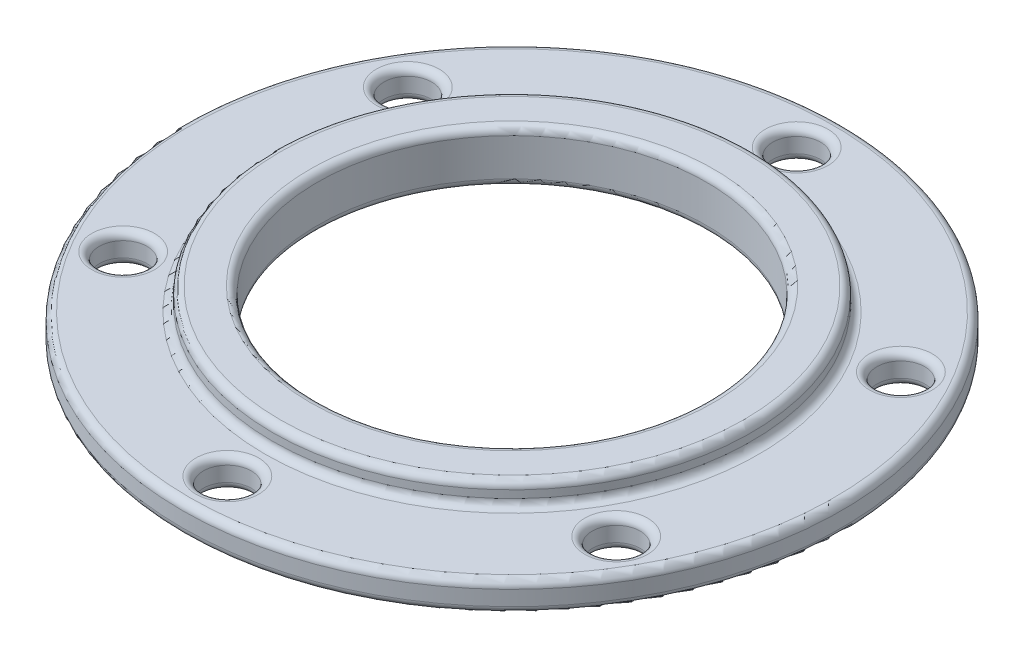
ISO-10303-21;
HEADER;
FILE_DESCRIPTION(('STEP AP214'),'2;1');
FILE_NAME('part.step','',(''),(''),'','','');
FILE_SCHEMA(('AUTOMOTIVE_DESIGN { 1 0 10303 214 1 1 1 1 }'));
ENDSEC;
DATA;
#1=APPLICATION_CONTEXT('core data for automotive mechanical design processes');
#2=APPLICATION_PROTOCOL_DEFINITION('international standard','automotive_design',2000,#1);
#3=PRODUCT_CONTEXT('',#1,'mechanical');
#4=PRODUCT('Part','Part','',(#3));
#5=PRODUCT_RELATED_PRODUCT_CATEGORY('part','',(#4));
#6=PRODUCT_DEFINITION_FORMATION('','',#4);
#7=PRODUCT_DEFINITION_CONTEXT('part definition',#1,'design');
#8=PRODUCT_DEFINITION('design','',#6,#7);
#9=PRODUCT_DEFINITION_SHAPE('','',#8);
#10=(LENGTH_UNIT() NAMED_UNIT(*) SI_UNIT(.MILLI.,.METRE.));
#11=(NAMED_UNIT(*) PLANE_ANGLE_UNIT() SI_UNIT($,.RADIAN.));
#12=(NAMED_UNIT(*) SI_UNIT($,.STERADIAN.) SOLID_ANGLE_UNIT());
#13=UNCERTAINTY_MEASURE_WITH_UNIT(LENGTH_MEASURE(1.E-05),#10,'distance_accuracy_value','');
#14=(GEOMETRIC_REPRESENTATION_CONTEXT(3) GLOBAL_UNCERTAINTY_ASSIGNED_CONTEXT((#13)) GLOBAL_UNIT_ASSIGNED_CONTEXT((#10,
#11,#12)) REPRESENTATION_CONTEXT('',''));
#15=CARTESIAN_POINT('',(0.,0.,0.));
#16=DIRECTION('',(0.,0.,1.));
#17=DIRECTION('',(1.,0.,0.));
#18=AXIS2_PLACEMENT_3D('',#15,#16,#17);
#19=CARTESIAN_POINT('',(0.,0.,0.));
#20=DIRECTION('',(0.,1.,0.));
#21=DIRECTION('',(0.,0.,1.));
#22=AXIS2_PLACEMENT_3D('',#19,#20,#21);
#23=PLANE('',#22);
#24=CARTESIAN_POINT('',(0.,0.,0.));
#25=DIRECTION('',(0.,1.,0.));
#26=DIRECTION('',(0.,0.,1.));
#27=AXIS2_PLACEMENT_3D('',#24,#25,#26);
#28=CIRCLE('',#27,16.5);
#29=CARTESIAN_POINT('',(0.,0.,16.5));
#30=VERTEX_POINT('',#29);
#31=EDGE_CURVE('E137',#30,#30,#28,.F.);
#32=ORIENTED_EDGE('',*,*,#31,.T.);
#33=EDGE_LOOP('',(#32));
#34=FACE_BOUND('',#33,.T.);
#35=CARTESIAN_POINT('',(-16.4761333069959,0.,-9.51249999999757));
#36=DIRECTION('',(0.,1.,0.));
#37=DIRECTION('',(0.,0.,1.));
#38=AXIS2_PLACEMENT_3D('',#35,#36,#37);
#39=CIRCLE('',#38,2.10000000000188);
#40=CARTESIAN_POINT('',(-16.4761333069959,0.,-7.4124999999957));
#41=VERTEX_POINT('',#40);
#42=EDGE_CURVE('E141',#41,#41,#39,.F.);
#43=ORIENTED_EDGE('',*,*,#42,.T.);
#44=EDGE_LOOP('',(#43));
#45=FACE_BOUND('',#44,.T.);
#46=CARTESIAN_POINT('',(-16.4761333069948,0.,9.51249999999948));
#47=DIRECTION('',(0.,1.,0.));
#48=DIRECTION('',(0.,0.,1.));
#49=AXIS2_PLACEMENT_3D('',#46,#47,#48);
#50=CIRCLE('',#49,2.10000000000286);
#51=CARTESIAN_POINT('',(-16.4761333069948,0.,11.6125000000023));
#52=VERTEX_POINT('',#51);
#53=EDGE_CURVE('E145',#52,#52,#50,.F.);
#54=ORIENTED_EDGE('',*,*,#53,.T.);
#55=EDGE_LOOP('',(#54));
#56=FACE_BOUND('',#55,.T.);
#57=CARTESIAN_POINT('',(2.16978020385542E-12,0.,19.0249999999971));
#58=DIRECTION('',(0.,1.,0.));
#59=DIRECTION('',(0.,0.,1.));
#60=AXIS2_PLACEMENT_3D('',#57,#58,#59);
#61=CIRCLE('',#60,2.10000000000306);
#62=CARTESIAN_POINT('',(2.16978020385542E-12,0.,21.1250000000001));
#63=VERTEX_POINT('',#62);
#64=EDGE_CURVE('E149',#63,#63,#61,.F.);
#65=ORIENTED_EDGE('',*,*,#64,.T.);
#66=EDGE_LOOP('',(#65));
#67=FACE_BOUND('',#66,.T.);
#68=CARTESIAN_POINT('',(16.476133306998,0.,9.51249999999758));
#69=DIRECTION('',(0.,1.,0.));
#70=DIRECTION('',(0.,0.,1.));
#71=AXIS2_PLACEMENT_3D('',#68,#69,#70);
#72=CIRCLE('',#71,2.10000000000223);
#73=CARTESIAN_POINT('',(16.476133306998,0.,11.6124999999998));
#74=VERTEX_POINT('',#73);
#75=EDGE_CURVE('E153',#74,#74,#72,.F.);
#76=ORIENTED_EDGE('',*,*,#75,.T.);
#77=EDGE_LOOP('',(#76));
#78=FACE_BOUND('',#77,.T.);
#79=CARTESIAN_POINT('',(16.4761333069969,0.,-9.51249999999948));
#80=DIRECTION('',(0.,1.,0.));
#81=DIRECTION('',(0.,0.,1.));
#82=AXIS2_PLACEMENT_3D('',#79,#80,#81);
#83=CIRCLE('',#82,2.10000000000115);
#84=CARTESIAN_POINT('',(16.4761333069969,0.,-7.41249999999832));
#85=VERTEX_POINT('',#84);
#86=EDGE_CURVE('E157',#85,#85,#83,.F.);
#87=ORIENTED_EDGE('',*,*,#86,.T.);
#88=EDGE_LOOP('',(#87));
#89=FACE_BOUND('',#88,.T.);
#90=CARTESIAN_POINT('',(0.,0.,-19.0249999999971));
#91=DIRECTION('',(0.,1.,0.));
#92=DIRECTION('',(0.,0.,1.));
#93=AXIS2_PLACEMENT_3D('',#90,#91,#92);
#94=CIRCLE('',#93,2.10000000000087);
#95=CARTESIAN_POINT('',(0.,0.,-16.9249999999962));
#96=VERTEX_POINT('',#95);
#97=EDGE_CURVE('E160',#96,#96,#94,.F.);
#98=ORIENTED_EDGE('',*,*,#97,.T.);
#99=EDGE_LOOP('',(#98));
#100=FACE_BOUND('',#99,.T.);
#101=CARTESIAN_POINT('',(0.,0.,0.));
#102=DIRECTION('',(0.,1.,0.));
#103=DIRECTION('',(0.,0.,1.));
#104=AXIS2_PLACEMENT_3D('',#101,#102,#103);
#105=CIRCLE('',#104,21.525);
#106=CARTESIAN_POINT('',(0.,0.,21.525));
#107=VERTEX_POINT('',#106);
#108=EDGE_CURVE('E164',#107,#107,#105,.T.);
#109=ORIENTED_EDGE('',*,*,#108,.T.);
#110=EDGE_LOOP('',(#109));
#111=FACE_BOUND('',#110,.T.);
#112=ADVANCED_FACE('F39',(#34,#45,#56,#67,#78,#89,#100,#111),#23,.T.);
#113=CARTESIAN_POINT('',(0.,-2.,0.));
#114=DIRECTION('',(0.,1.,0.));
#115=DIRECTION('',(0.,0.,1.));
#116=AXIS2_PLACEMENT_3D('',#113,#114,#115);
#117=CYLINDRICAL_SURFACE('',#116,22.025);
#118=CARTESIAN_POINT('',(0.,-0.5,0.));
#119=DIRECTION('',(0.,1.,0.));
#120=DIRECTION('',(0.,0.,1.));
#121=AXIS2_PLACEMENT_3D('',#118,#119,#120);
#122=CIRCLE('',#121,22.025);
#123=CARTESIAN_POINT('',(0.,-0.5,22.025));
#124=VERTEX_POINT('',#123);
#125=EDGE_CURVE('E82',#124,#124,#122,.F.);
#126=ORIENTED_EDGE('',*,*,#125,.T.);
#127=EDGE_LOOP('',(#126));
#128=FACE_BOUND('',#127,.T.);
#129=CARTESIAN_POINT('',(0.,-1.5,0.));
#130=DIRECTION('',(0.,1.,0.));
#131=DIRECTION('',(0.,0.,1.));
#132=AXIS2_PLACEMENT_3D('',#129,#130,#131);
#133=CIRCLE('',#132,22.025);
#134=CARTESIAN_POINT('',(0.,-1.5,22.025));
#135=VERTEX_POINT('',#134);
#136=EDGE_CURVE('E86',#135,#135,#133,.T.);
#137=ORIENTED_EDGE('',*,*,#136,.T.);
#138=EDGE_LOOP('',(#137));
#139=FACE_BOUND('',#138,.T.);
#140=ADVANCED_FACE('F206',(#128,#139),#117,.T.);
#141=CARTESIAN_POINT('',(0.,-2.,0.));
#142=DIRECTION('',(0.,1.,0.));
#143=DIRECTION('',(0.,0.,1.));
#144=AXIS2_PLACEMENT_3D('',#141,#142,#143);
#145=PLANE('',#144);
#146=CARTESIAN_POINT('',(0.,-2.,0.));
#147=DIRECTION('',(0.,1.,0.));
#148=DIRECTION('',(0.,0.,1.));
#149=AXIS2_PLACEMENT_3D('',#146,#147,#148);
#150=CIRCLE('',#149,21.525);
#151=CARTESIAN_POINT('',(0.,-2.,21.525));
#152=VERTEX_POINT('',#151);
#153=EDGE_CURVE('E10',#152,#152,#150,.F.);
#154=ORIENTED_EDGE('',*,*,#153,.T.);
#155=EDGE_LOOP('',(#154));
#156=FACE_BOUND('',#155,.T.);
#157=CARTESIAN_POINT('',(0.,-2.,-19.0249999999971));
#158=DIRECTION('',(0.,1.,0.));
#159=DIRECTION('',(0.,0.,1.));
#160=AXIS2_PLACEMENT_3D('',#157,#158,#159);
#161=CIRCLE('',#160,2.10000000000087);
#162=CARTESIAN_POINT('',(0.,-2.,-16.9249999999962));
#163=VERTEX_POINT('',#162);
#164=EDGE_CURVE('E47',#163,#163,#161,.T.);
#165=ORIENTED_EDGE('',*,*,#164,.T.);
#166=EDGE_LOOP('',(#165));
#167=FACE_BOUND('',#166,.T.);
#168=CARTESIAN_POINT('',(0.,-2.,0.));
#169=DIRECTION('',(0.,1.,0.));
#170=DIRECTION('',(0.,0.,1.));
#171=AXIS2_PLACEMENT_3D('',#168,#169,#170);
#172=CIRCLE('',#171,13.5);
#173=CARTESIAN_POINT('',(0.,-2.,13.5));
#174=VERTEX_POINT('',#173);
#175=EDGE_CURVE('E54',#174,#174,#172,.T.);
#176=ORIENTED_EDGE('',*,*,#175,.T.);
#177=EDGE_LOOP('',(#176));
#178=FACE_BOUND('',#177,.T.);
#179=CARTESIAN_POINT('',(16.4761333069969,-2.,-9.51249999999948));
#180=DIRECTION('',(0.,1.,0.));
#181=DIRECTION('',(0.,0.,1.));
#182=AXIS2_PLACEMENT_3D('',#179,#180,#181);
#183=CIRCLE('',#182,2.10000000000115);
#184=CARTESIAN_POINT('',(16.4761333069969,-2.,-7.41249999999832));
#185=VERTEX_POINT('',#184);
#186=EDGE_CURVE('E60',#185,#185,#183,.T.);
#187=ORIENTED_EDGE('',*,*,#186,.T.);
#188=EDGE_LOOP('',(#187));
#189=FACE_BOUND('',#188,.T.);
#190=CARTESIAN_POINT('',(16.476133306998,-2.,9.51249999999758));
#191=DIRECTION('',(0.,1.,0.));
#192=DIRECTION('',(0.,0.,1.));
#193=AXIS2_PLACEMENT_3D('',#190,#191,#192);
#194=CIRCLE('',#193,2.10000000000223);
#195=CARTESIAN_POINT('',(16.476133306998,-2.,11.6124999999998));
#196=VERTEX_POINT('',#195);
#197=EDGE_CURVE('E66',#196,#196,#194,.T.);
#198=ORIENTED_EDGE('',*,*,#197,.T.);
#199=EDGE_LOOP('',(#198));
#200=FACE_BOUND('',#199,.T.);
#201=CARTESIAN_POINT('',(2.16978020385542E-12,-2.,19.0249999999971));
#202=DIRECTION('',(0.,1.,0.));
#203=DIRECTION('',(0.,0.,1.));
#204=AXIS2_PLACEMENT_3D('',#201,#202,#203);
#205=CIRCLE('',#204,2.10000000000306);
#206=CARTESIAN_POINT('',(2.16978020385542E-12,-2.,21.1250000000001));
#207=VERTEX_POINT('',#206);
#208=EDGE_CURVE('E70',#207,#207,#205,.T.);
#209=ORIENTED_EDGE('',*,*,#208,.T.);
#210=EDGE_LOOP('',(#209));
#211=FACE_BOUND('',#210,.T.);
#212=CARTESIAN_POINT('',(-16.4761333069948,-2.,9.51249999999948));
#213=DIRECTION('',(0.,1.,0.));
#214=DIRECTION('',(0.,0.,1.));
#215=AXIS2_PLACEMENT_3D('',#212,#213,#214);
#216=CIRCLE('',#215,2.10000000000286);
#217=CARTESIAN_POINT('',(-16.4761333069948,-2.,11.6125000000023));
#218=VERTEX_POINT('',#217);
#219=EDGE_CURVE('E74',#218,#218,#216,.T.);
#220=ORIENTED_EDGE('',*,*,#219,.T.);
#221=EDGE_LOOP('',(#220));
#222=FACE_BOUND('',#221,.T.);
#223=CARTESIAN_POINT('',(-16.4761333069959,-2.,-9.51249999999757));
#224=DIRECTION('',(0.,1.,0.));
#225=DIRECTION('',(0.,0.,1.));
#226=AXIS2_PLACEMENT_3D('',#223,#224,#225);
#227=CIRCLE('',#226,2.10000000000188);
#228=CARTESIAN_POINT('',(-16.4761333069959,-2.,-7.4124999999957));
#229=VERTEX_POINT('',#228);
#230=EDGE_CURVE('E78',#229,#229,#227,.T.);
#231=ORIENTED_EDGE('',*,*,#230,.T.);
#232=EDGE_LOOP('',(#231));
#233=FACE_BOUND('',#232,.T.);
#234=ADVANCED_FACE('F202',(#156,#167,#178,#189,#200,#211,#222,#233),#145,.F.);
#235=CARTESIAN_POINT('',(0.,-2.,-19.0249999999971));
#236=DIRECTION('',(0.,1.,0.));
#237=DIRECTION('',(0.,0.,1.));
#238=AXIS2_PLACEMENT_3D('',#235,#236,#237);
#239=CYLINDRICAL_SURFACE('',#238,1.60000000000087);
#240=CARTESIAN_POINT('',(0.,-0.5,-19.0249999999971));
#241=DIRECTION('',(0.,1.,0.));
#242=DIRECTION('',(0.,0.,1.));
#243=AXIS2_PLACEMENT_3D('',#240,#241,#242);
#244=CIRCLE('',#243,1.60000000000087);
#245=CARTESIAN_POINT('',(0.,-0.5,-17.4249999999962));
#246=VERTEX_POINT('',#245);
#247=EDGE_CURVE('E90',#246,#246,#244,.T.);
#248=ORIENTED_EDGE('',*,*,#247,.T.);
#249=EDGE_LOOP('',(#248));
#250=FACE_BOUND('',#249,.T.);
#251=CARTESIAN_POINT('',(0.,-1.5,-19.0249999999971));
#252=DIRECTION('',(0.,1.,0.));
#253=DIRECTION('',(0.,0.,1.));
#254=AXIS2_PLACEMENT_3D('',#251,#252,#253);
#255=CIRCLE('',#254,1.60000000000087);
#256=CARTESIAN_POINT('',(0.,-1.5,-17.4249999999962));
#257=VERTEX_POINT('',#256);
#258=EDGE_CURVE('E94',#257,#257,#255,.F.);
#259=ORIENTED_EDGE('',*,*,#258,.T.);
#260=EDGE_LOOP('',(#259));
#261=FACE_BOUND('',#260,.T.);
#262=ADVANCED_FACE('F205',(#250,#261),#239,.F.);
#263=CARTESIAN_POINT('',(0.,-2.,0.));
#264=DIRECTION('',(0.,1.,0.));
#265=DIRECTION('',(0.,0.,1.));
#266=AXIS2_PLACEMENT_3D('',#263,#264,#265);
#267=CYLINDRICAL_SURFACE('',#266,13.);
#268=CARTESIAN_POINT('',(0.,1.,0.));
#269=DIRECTION('',(0.,1.,0.));
#270=DIRECTION('',(0.,0.,1.));
#271=AXIS2_PLACEMENT_3D('',#268,#269,#270);
#272=CIRCLE('',#271,13.);
#273=CARTESIAN_POINT('',(0.,1.,13.));
#274=VERTEX_POINT('',#273);
#275=EDGE_CURVE('E184',#274,#274,#272,.T.);
#276=ORIENTED_EDGE('',*,*,#275,.T.);
#277=EDGE_LOOP('',(#276));
#278=FACE_BOUND('',#277,.T.);
#279=CARTESIAN_POINT('',(0.,-1.5,0.));
#280=DIRECTION('',(0.,1.,0.));
#281=DIRECTION('',(0.,0.,1.));
#282=AXIS2_PLACEMENT_3D('',#279,#280,#281);
#283=CIRCLE('',#282,13.);
#284=CARTESIAN_POINT('',(0.,-1.5,13.));
#285=VERTEX_POINT('',#284);
#286=EDGE_CURVE('E188',#285,#285,#283,.F.);
#287=ORIENTED_EDGE('',*,*,#286,.T.);
#288=EDGE_LOOP('',(#287));
#289=FACE_BOUND('',#288,.T.);
#290=ADVANCED_FACE('F192',(#278,#289),#267,.F.);
#291=CARTESIAN_POINT('',(16.4761333069969,-2.,-9.51249999999948));
#292=DIRECTION('',(0.,1.,0.));
#293=DIRECTION('',(0.,0.,1.));
#294=AXIS2_PLACEMENT_3D('',#291,#292,#293);
#295=CYLINDRICAL_SURFACE('',#294,1.60000000000115);
#296=CARTESIAN_POINT('',(16.4761333069969,-0.5,-9.51249999999948));
#297=DIRECTION('',(0.,1.,0.));
#298=DIRECTION('',(0.,0.,1.));
#299=AXIS2_PLACEMENT_3D('',#296,#297,#298);
#300=CIRCLE('',#299,1.60000000000115);
#301=CARTESIAN_POINT('',(16.4761333069969,-0.5,-7.91249999999832));
#302=VERTEX_POINT('',#301);
#303=EDGE_CURVE('E97',#302,#302,#300,.T.);
#304=ORIENTED_EDGE('',*,*,#303,.T.);
#305=EDGE_LOOP('',(#304));
#306=FACE_BOUND('',#305,.T.);
#307=CARTESIAN_POINT('',(16.4761333069969,-1.5,-9.51249999999948));
#308=DIRECTION('',(0.,1.,0.));
#309=DIRECTION('',(0.,0.,1.));
#310=AXIS2_PLACEMENT_3D('',#307,#308,#309);
#311=CIRCLE('',#310,1.60000000000115);
#312=CARTESIAN_POINT('',(16.4761333069969,-1.5,-7.91249999999832));
#313=VERTEX_POINT('',#312);
#314=EDGE_CURVE('E101',#313,#313,#311,.F.);
#315=ORIENTED_EDGE('',*,*,#314,.T.);
#316=EDGE_LOOP('',(#315));
#317=FACE_BOUND('',#316,.T.);
#318=ADVANCED_FACE('F313',(#306,#317),#295,.F.);
#319=CARTESIAN_POINT('',(16.476133306998,-2.,9.51249999999758));
#320=DIRECTION('',(0.,1.,0.));
#321=DIRECTION('',(0.,0.,1.));
#322=AXIS2_PLACEMENT_3D('',#319,#320,#321);
#323=CYLINDRICAL_SURFACE('',#322,1.60000000000223);
#324=CARTESIAN_POINT('',(16.476133306998,-0.5,9.51249999999758));
#325=DIRECTION('',(0.,1.,0.));
#326=DIRECTION('',(0.,0.,1.));
#327=AXIS2_PLACEMENT_3D('',#324,#325,#326);
#328=CIRCLE('',#327,1.60000000000223);
#329=CARTESIAN_POINT('',(16.476133306998,-0.5,11.1124999999998));
#330=VERTEX_POINT('',#329);
#331=EDGE_CURVE('E105',#330,#330,#328,.T.);
#332=ORIENTED_EDGE('',*,*,#331,.T.);
#333=EDGE_LOOP('',(#332));
#334=FACE_BOUND('',#333,.T.);
#335=CARTESIAN_POINT('',(16.476133306998,-1.5,9.51249999999758));
#336=DIRECTION('',(0.,1.,0.));
#337=DIRECTION('',(0.,0.,1.));
#338=AXIS2_PLACEMENT_3D('',#335,#336,#337);
#339=CIRCLE('',#338,1.60000000000223);
#340=CARTESIAN_POINT('',(16.476133306998,-1.5,11.1124999999998));
#341=VERTEX_POINT('',#340);
#342=EDGE_CURVE('E109',#341,#341,#339,.F.);
#343=ORIENTED_EDGE('',*,*,#342,.T.);
#344=EDGE_LOOP('',(#343));
#345=FACE_BOUND('',#344,.T.);
#346=ADVANCED_FACE('F303',(#334,#345),#323,.F.);
#347=CARTESIAN_POINT('',(2.16978020385542E-12,-2.,19.0249999999971));
#348=DIRECTION('',(0.,1.,0.));
#349=DIRECTION('',(0.,0.,1.));
#350=AXIS2_PLACEMENT_3D('',#347,#348,#349);
#351=CYLINDRICAL_SURFACE('',#350,1.60000000000306);
#352=CARTESIAN_POINT('',(2.16978020385542E-12,-0.5,19.0249999999971));
#353=DIRECTION('',(0.,1.,0.));
#354=DIRECTION('',(0.,0.,1.));
#355=AXIS2_PLACEMENT_3D('',#352,#353,#354);
#356=CIRCLE('',#355,1.60000000000306);
#357=CARTESIAN_POINT('',(2.16978020385542E-12,-0.5,20.6250000000001));
#358=VERTEX_POINT('',#357);
#359=EDGE_CURVE('E113',#358,#358,#356,.T.);
#360=ORIENTED_EDGE('',*,*,#359,.T.);
#361=EDGE_LOOP('',(#360));
#362=FACE_BOUND('',#361,.T.);
#363=CARTESIAN_POINT('',(2.16978020385542E-12,-1.5,19.0249999999971));
#364=DIRECTION('',(0.,1.,0.));
#365=DIRECTION('',(0.,0.,1.));
#366=AXIS2_PLACEMENT_3D('',#363,#364,#365);
#367=CIRCLE('',#366,1.60000000000306);
#368=CARTESIAN_POINT('',(2.16978020385542E-12,-1.5,20.6250000000001));
#369=VERTEX_POINT('',#368);
#370=EDGE_CURVE('E117',#369,#369,#367,.F.);
#371=ORIENTED_EDGE('',*,*,#370,.T.);
#372=EDGE_LOOP('',(#371));
#373=FACE_BOUND('',#372,.T.);
#374=ADVANCED_FACE('F300',(#362,#373),#351,.F.);
#375=CARTESIAN_POINT('',(-16.4761333069948,-2.,9.51249999999948));
#376=DIRECTION('',(0.,1.,0.));
#377=DIRECTION('',(0.,0.,1.));
#378=AXIS2_PLACEMENT_3D('',#375,#376,#377);
#379=CYLINDRICAL_SURFACE('',#378,1.60000000000286);
#380=CARTESIAN_POINT('',(-16.4761333069948,-0.5,9.51249999999948));
#381=DIRECTION('',(0.,1.,0.));
#382=DIRECTION('',(0.,0.,1.));
#383=AXIS2_PLACEMENT_3D('',#380,#381,#382);
#384=CIRCLE('',#383,1.60000000000286);
#385=CARTESIAN_POINT('',(-16.4761333069948,-0.5,11.1125000000023));
#386=VERTEX_POINT('',#385);
#387=EDGE_CURVE('E121',#386,#386,#384,.T.);
#388=ORIENTED_EDGE('',*,*,#387,.T.);
#389=EDGE_LOOP('',(#388));
#390=FACE_BOUND('',#389,.T.);
#391=CARTESIAN_POINT('',(-16.4761333069948,-1.5,9.51249999999948));
#392=DIRECTION('',(0.,1.,0.));
#393=DIRECTION('',(0.,0.,1.));
#394=AXIS2_PLACEMENT_3D('',#391,#392,#393);
#395=CIRCLE('',#394,1.60000000000286);
#396=CARTESIAN_POINT('',(-16.4761333069948,-1.5,11.1125000000023));
#397=VERTEX_POINT('',#396);
#398=EDGE_CURVE('E125',#397,#397,#395,.F.);
#399=ORIENTED_EDGE('',*,*,#398,.T.);
#400=EDGE_LOOP('',(#399));
#401=FACE_BOUND('',#400,.T.);
#402=ADVANCED_FACE('F302',(#390,#401),#379,.F.);
#403=CARTESIAN_POINT('',(-16.4761333069959,-2.,-9.51249999999757));
#404=DIRECTION('',(0.,1.,0.));
#405=DIRECTION('',(0.,0.,1.));
#406=AXIS2_PLACEMENT_3D('',#403,#404,#405);
#407=CYLINDRICAL_SURFACE('',#406,1.60000000000188);
#408=CARTESIAN_POINT('',(-16.4761333069959,-0.5,-9.51249999999757));
#409=DIRECTION('',(0.,1.,0.));
#410=DIRECTION('',(0.,0.,1.));
#411=AXIS2_PLACEMENT_3D('',#408,#409,#410);
#412=CIRCLE('',#411,1.60000000000188);
#413=CARTESIAN_POINT('',(-16.4761333069959,-0.5,-7.9124999999957));
#414=VERTEX_POINT('',#413);
#415=EDGE_CURVE('E129',#414,#414,#412,.T.);
#416=ORIENTED_EDGE('',*,*,#415,.T.);
#417=EDGE_LOOP('',(#416));
#418=FACE_BOUND('',#417,.T.);
#419=CARTESIAN_POINT('',(-16.4761333069959,-1.5,-9.51249999999757));
#420=DIRECTION('',(0.,1.,0.));
#421=DIRECTION('',(0.,0.,1.));
#422=AXIS2_PLACEMENT_3D('',#419,#420,#421);
#423=CIRCLE('',#422,1.60000000000188);
#424=CARTESIAN_POINT('',(-16.4761333069959,-1.5,-7.9124999999957));
#425=VERTEX_POINT('',#424);
#426=EDGE_CURVE('E133',#425,#425,#423,.F.);
#427=ORIENTED_EDGE('',*,*,#426,.T.);
#428=EDGE_LOOP('',(#427));
#429=FACE_BOUND('',#428,.T.);
#430=ADVANCED_FACE('F310',(#418,#429),#407,.F.);
#431=CARTESIAN_POINT('',(0.,1.5,0.));
#432=DIRECTION('',(0.,1.,0.));
#433=DIRECTION('',(0.,0.,1.));
#434=AXIS2_PLACEMENT_3D('',#431,#432,#433);
#435=PLANE('',#434);
#436=CARTESIAN_POINT('',(0.,1.5,0.));
#437=DIRECTION('',(0.,1.,0.));
#438=DIRECTION('',(0.,0.,1.));
#439=AXIS2_PLACEMENT_3D('',#436,#437,#438);
#440=CIRCLE('',#439,13.5);
#441=CARTESIAN_POINT('',(0.,1.5,13.5));
#442=VERTEX_POINT('',#441);
#443=EDGE_CURVE('E176',#442,#442,#440,.F.);
#444=ORIENTED_EDGE('',*,*,#443,.T.);
#445=EDGE_LOOP('',(#444));
#446=FACE_BOUND('',#445,.T.);
#447=CARTESIAN_POINT('',(0.,1.5,0.));
#448=DIRECTION('',(0.,1.,0.));
#449=DIRECTION('',(0.,0.,1.));
#450=AXIS2_PLACEMENT_3D('',#447,#448,#449);
#451=CIRCLE('',#450,15.5);
#452=CARTESIAN_POINT('',(0.,1.5,15.5));
#453=VERTEX_POINT('',#452);
#454=EDGE_CURVE('E180',#453,#453,#451,.T.);
#455=ORIENTED_EDGE('',*,*,#454,.T.);
#456=EDGE_LOOP('',(#455));
#457=FACE_BOUND('',#456,.T.);
#458=ADVANCED_FACE('F369',(#446,#457),#435,.T.);
#459=CARTESIAN_POINT('',(0.,1.5,0.));
#460=DIRECTION('',(0.,-1.,0.));
#461=DIRECTION('',(0.,0.,-1.));
#462=AXIS2_PLACEMENT_3D('',#459,#460,#461);
#463=CYLINDRICAL_SURFACE('',#462,16.);
#464=CARTESIAN_POINT('',(0.,1.,0.));
#465=DIRECTION('',(0.,1.,0.));
#466=DIRECTION('',(0.,0.,1.));
#467=AXIS2_PLACEMENT_3D('',#464,#465,#466);
#468=CIRCLE('',#467,16.);
#469=CARTESIAN_POINT('',(0.,1.,16.));
#470=VERTEX_POINT('',#469);
#471=EDGE_CURVE('E168',#470,#470,#468,.F.);
#472=ORIENTED_EDGE('',*,*,#471,.T.);
#473=EDGE_LOOP('',(#472));
#474=FACE_BOUND('',#473,.T.);
#475=CARTESIAN_POINT('',(0.,0.5,0.));
#476=DIRECTION('',(0.,1.,0.));
#477=DIRECTION('',(0.,0.,1.));
#478=AXIS2_PLACEMENT_3D('',#475,#476,#477);
#479=CIRCLE('',#478,16.);
#480=CARTESIAN_POINT('',(0.,0.5,16.));
#481=VERTEX_POINT('',#480);
#482=EDGE_CURVE('E172',#481,#481,#479,.T.);
#483=ORIENTED_EDGE('',*,*,#482,.T.);
#484=EDGE_LOOP('',(#483));
#485=FACE_BOUND('',#484,.T.);
#486=ADVANCED_FACE('F242',(#474,#485),#463,.T.);
#487=CARTESIAN_POINT('',(0.,1.,0.));
#488=DIRECTION('',(0.,1.,0.));
#489=DIRECTION('',(0.,0.,1.));
#490=AXIS2_PLACEMENT_3D('',#487,#488,#489);
#491=TOROIDAL_SURFACE('',#490,13.5,0.5);
#492=ORIENTED_EDGE('',*,*,#443,.F.);
#493=EDGE_LOOP('',(#492));
#494=FACE_BOUND('',#493,.T.);
#495=ORIENTED_EDGE('',*,*,#275,.F.);
#496=EDGE_LOOP('',(#495));
#497=FACE_BOUND('',#496,.T.);
#498=ADVANCED_FACE('F238',(#494,#497),#491,.T.);
#499=CARTESIAN_POINT('',(0.,1.,0.));
#500=DIRECTION('',(0.,1.,0.));
#501=DIRECTION('',(0.,0.,1.));
#502=AXIS2_PLACEMENT_3D('',#499,#500,#501);
#503=TOROIDAL_SURFACE('',#502,15.5,0.5);
#504=ORIENTED_EDGE('',*,*,#471,.F.);
#505=EDGE_LOOP('',(#504));
#506=FACE_BOUND('',#505,.T.);
#507=ORIENTED_EDGE('',*,*,#454,.F.);
#508=EDGE_LOOP('',(#507));
#509=FACE_BOUND('',#508,.T.);
#510=ADVANCED_FACE('F241',(#506,#509),#503,.T.);
#511=CARTESIAN_POINT('',(0.,0.5,0.));
#512=DIRECTION('',(0.,1.,0.));
#513=DIRECTION('',(0.,0.,1.));
#514=AXIS2_PLACEMENT_3D('',#511,#512,#513);
#515=TOROIDAL_SURFACE('',#514,16.5,0.5);
#516=ORIENTED_EDGE('',*,*,#31,.F.);
#517=EDGE_LOOP('',(#516));
#518=FACE_BOUND('',#517,.T.);
#519=ORIENTED_EDGE('',*,*,#482,.F.);
#520=EDGE_LOOP('',(#519));
#521=FACE_BOUND('',#520,.T.);
#522=ADVANCED_FACE('F246',(#518,#521),#515,.F.);
#523=CARTESIAN_POINT('',(-16.4761333069959,-0.5,-9.51249999999757));
#524=DIRECTION('',(0.,1.,0.));
#525=DIRECTION('',(0.,0.,1.));
#526=AXIS2_PLACEMENT_3D('',#523,#524,#525);
#527=TOROIDAL_SURFACE('',#526,2.10000000000188,0.5);
#528=ORIENTED_EDGE('',*,*,#42,.F.);
#529=EDGE_LOOP('',(#528));
#530=FACE_BOUND('',#529,.T.);
#531=ORIENTED_EDGE('',*,*,#415,.F.);
#532=EDGE_LOOP('',(#531));
#533=FACE_BOUND('',#532,.T.);
#534=ADVANCED_FACE('F250',(#530,#533),#527,.T.);
#535=CARTESIAN_POINT('',(-16.4761333069948,-0.5,9.51249999999948));
#536=DIRECTION('',(0.,1.,0.));
#537=DIRECTION('',(0.,0.,1.));
#538=AXIS2_PLACEMENT_3D('',#535,#536,#537);
#539=TOROIDAL_SURFACE('',#538,2.10000000000286,0.5);
#540=ORIENTED_EDGE('',*,*,#53,.F.);
#541=EDGE_LOOP('',(#540));
#542=FACE_BOUND('',#541,.T.);
#543=ORIENTED_EDGE('',*,*,#387,.F.);
#544=EDGE_LOOP('',(#543));
#545=FACE_BOUND('',#544,.T.);
#546=ADVANCED_FACE('F254',(#542,#545),#539,.T.);
#547=CARTESIAN_POINT('',(2.16978020385542E-12,-0.5,19.0249999999971));
#548=DIRECTION('',(0.,1.,0.));
#549=DIRECTION('',(0.,0.,1.));
#550=AXIS2_PLACEMENT_3D('',#547,#548,#549);
#551=TOROIDAL_SURFACE('',#550,2.10000000000306,0.5);
#552=ORIENTED_EDGE('',*,*,#64,.F.);
#553=EDGE_LOOP('',(#552));
#554=FACE_BOUND('',#553,.T.);
#555=ORIENTED_EDGE('',*,*,#359,.F.);
#556=EDGE_LOOP('',(#555));
#557=FACE_BOUND('',#556,.T.);
#558=ADVANCED_FACE('F258',(#554,#557),#551,.T.);
#559=CARTESIAN_POINT('',(16.476133306998,-0.5,9.51249999999758));
#560=DIRECTION('',(0.,1.,0.));
#561=DIRECTION('',(0.,0.,1.));
#562=AXIS2_PLACEMENT_3D('',#559,#560,#561);
#563=TOROIDAL_SURFACE('',#562,2.10000000000223,0.5);
#564=ORIENTED_EDGE('',*,*,#75,.F.);
#565=EDGE_LOOP('',(#564));
#566=FACE_BOUND('',#565,.T.);
#567=ORIENTED_EDGE('',*,*,#331,.F.);
#568=EDGE_LOOP('',(#567));
#569=FACE_BOUND('',#568,.T.);
#570=ADVANCED_FACE('F262',(#566,#569),#563,.T.);
#571=CARTESIAN_POINT('',(16.4761333069969,-0.5,-9.51249999999948));
#572=DIRECTION('',(0.,1.,0.));
#573=DIRECTION('',(0.,0.,1.));
#574=AXIS2_PLACEMENT_3D('',#571,#572,#573);
#575=TOROIDAL_SURFACE('',#574,2.10000000000115,0.5);
#576=ORIENTED_EDGE('',*,*,#86,.F.);
#577=EDGE_LOOP('',(#576));
#578=FACE_BOUND('',#577,.T.);
#579=ORIENTED_EDGE('',*,*,#303,.F.);
#580=EDGE_LOOP('',(#579));
#581=FACE_BOUND('',#580,.T.);
#582=ADVANCED_FACE('F266',(#578,#581),#575,.T.);
#583=CARTESIAN_POINT('',(0.,-0.5,-19.0249999999971));
#584=DIRECTION('',(0.,1.,0.));
#585=DIRECTION('',(0.,0.,1.));
#586=AXIS2_PLACEMENT_3D('',#583,#584,#585);
#587=TOROIDAL_SURFACE('',#586,2.10000000000087,0.5);
#588=ORIENTED_EDGE('',*,*,#97,.F.);
#589=EDGE_LOOP('',(#588));
#590=FACE_BOUND('',#589,.T.);
#591=ORIENTED_EDGE('',*,*,#247,.F.);
#592=EDGE_LOOP('',(#591));
#593=FACE_BOUND('',#592,.T.);
#594=ADVANCED_FACE('F270',(#590,#593),#587,.T.);
#595=CARTESIAN_POINT('',(0.,-0.5,0.));
#596=DIRECTION('',(0.,1.,0.));
#597=DIRECTION('',(0.,0.,1.));
#598=AXIS2_PLACEMENT_3D('',#595,#596,#597);
#599=TOROIDAL_SURFACE('',#598,21.525,0.5);
#600=ORIENTED_EDGE('',*,*,#125,.F.);
#601=EDGE_LOOP('',(#600));
#602=FACE_BOUND('',#601,.T.);
#603=ORIENTED_EDGE('',*,*,#108,.F.);
#604=EDGE_LOOP('',(#603));
#605=FACE_BOUND('',#604,.T.);
#606=ADVANCED_FACE('F274',(#602,#605),#599,.T.);
#607=CARTESIAN_POINT('',(0.,-1.5,0.));
#608=DIRECTION('',(0.,1.,0.));
#609=DIRECTION('',(0.,0.,1.));
#610=AXIS2_PLACEMENT_3D('',#607,#608,#609);
#611=TOROIDAL_SURFACE('',#610,21.525,0.5);
#612=ORIENTED_EDGE('',*,*,#153,.F.);
#613=EDGE_LOOP('',(#612));
#614=FACE_BOUND('',#613,.T.);
#615=ORIENTED_EDGE('',*,*,#136,.F.);
#616=EDGE_LOOP('',(#615));
#617=FACE_BOUND('',#616,.T.);
#618=ADVANCED_FACE('F278',(#614,#617),#611,.T.);
#619=CARTESIAN_POINT('',(0.,-1.5,-19.0249999999971));
#620=DIRECTION('',(0.,1.,0.));
#621=DIRECTION('',(0.,0.,1.));
#622=AXIS2_PLACEMENT_3D('',#619,#620,#621);
#623=TOROIDAL_SURFACE('',#622,2.10000000000087,0.5);
#624=ORIENTED_EDGE('',*,*,#258,.F.);
#625=EDGE_LOOP('',(#624));
#626=FACE_BOUND('',#625,.T.);
#627=ORIENTED_EDGE('',*,*,#164,.F.);
#628=EDGE_LOOP('',(#627));
#629=FACE_BOUND('',#628,.T.);
#630=ADVANCED_FACE('F198',(#626,#629),#623,.T.);
#631=CARTESIAN_POINT('',(0.,-1.5,0.));
#632=DIRECTION('',(0.,1.,0.));
#633=DIRECTION('',(0.,0.,1.));
#634=AXIS2_PLACEMENT_3D('',#631,#632,#633);
#635=TOROIDAL_SURFACE('',#634,13.5,0.5);
#636=ORIENTED_EDGE('',*,*,#286,.F.);
#637=EDGE_LOOP('',(#636));
#638=FACE_BOUND('',#637,.T.);
#639=ORIENTED_EDGE('',*,*,#175,.F.);
#640=EDGE_LOOP('',(#639));
#641=FACE_BOUND('',#640,.T.);
#642=ADVANCED_FACE('F194',(#638,#641),#635,.T.);
#643=CARTESIAN_POINT('',(16.4761333069969,-1.5,-9.51249999999948));
#644=DIRECTION('',(0.,1.,0.));
#645=DIRECTION('',(0.,0.,1.));
#646=AXIS2_PLACEMENT_3D('',#643,#644,#645);
#647=TOROIDAL_SURFACE('',#646,2.10000000000115,0.5);
#648=ORIENTED_EDGE('',*,*,#314,.F.);
#649=EDGE_LOOP('',(#648));
#650=FACE_BOUND('',#649,.T.);
#651=ORIENTED_EDGE('',*,*,#186,.F.);
#652=EDGE_LOOP('',(#651));
#653=FACE_BOUND('',#652,.T.);
#654=ADVANCED_FACE('F197',(#650,#653),#647,.T.);
#655=CARTESIAN_POINT('',(16.476133306998,-1.5,9.51249999999758));
#656=DIRECTION('',(0.,1.,0.));
#657=DIRECTION('',(0.,0.,1.));
#658=AXIS2_PLACEMENT_3D('',#655,#656,#657);
#659=TOROIDAL_SURFACE('',#658,2.10000000000223,0.5);
#660=ORIENTED_EDGE('',*,*,#342,.F.);
#661=EDGE_LOOP('',(#660));
#662=FACE_BOUND('',#661,.T.);
#663=ORIENTED_EDGE('',*,*,#197,.F.);
#664=EDGE_LOOP('',(#663));
#665=FACE_BOUND('',#664,.T.);
#666=ADVANCED_FACE('F288',(#662,#665),#659,.T.);
#667=CARTESIAN_POINT('',(2.16978020385542E-12,-1.5,19.0249999999971));
#668=DIRECTION('',(0.,1.,0.));
#669=DIRECTION('',(0.,0.,1.));
#670=AXIS2_PLACEMENT_3D('',#667,#668,#669);
#671=TOROIDAL_SURFACE('',#670,2.10000000000306,0.5);
#672=ORIENTED_EDGE('',*,*,#370,.F.);
#673=EDGE_LOOP('',(#672));
#674=FACE_BOUND('',#673,.T.);
#675=ORIENTED_EDGE('',*,*,#208,.F.);
#676=EDGE_LOOP('',(#675));
#677=FACE_BOUND('',#676,.T.);
#678=ADVANCED_FACE('F224',(#674,#677),#671,.T.);
#679=CARTESIAN_POINT('',(-16.4761333069948,-1.5,9.51249999999948));
#680=DIRECTION('',(0.,1.,0.));
#681=DIRECTION('',(0.,0.,1.));
#682=AXIS2_PLACEMENT_3D('',#679,#680,#681);
#683=TOROIDAL_SURFACE('',#682,2.10000000000286,0.5);
#684=ORIENTED_EDGE('',*,*,#398,.F.);
#685=EDGE_LOOP('',(#684));
#686=FACE_BOUND('',#685,.T.);
#687=ORIENTED_EDGE('',*,*,#219,.F.);
#688=EDGE_LOOP('',(#687));
#689=FACE_BOUND('',#688,.T.);
#690=ADVANCED_FACE('F219',(#686,#689),#683,.T.);
#691=CARTESIAN_POINT('',(-16.4761333069959,-1.5,-9.51249999999757));
#692=DIRECTION('',(0.,1.,0.));
#693=DIRECTION('',(0.,0.,1.));
#694=AXIS2_PLACEMENT_3D('',#691,#692,#693);
#695=TOROIDAL_SURFACE('',#694,2.10000000000188,0.5);
#696=ORIENTED_EDGE('',*,*,#426,.F.);
#697=EDGE_LOOP('',(#696));
#698=FACE_BOUND('',#697,.T.);
#699=ORIENTED_EDGE('',*,*,#230,.F.);
#700=EDGE_LOOP('',(#699));
#701=FACE_BOUND('',#700,.T.);
#702=ADVANCED_FACE('F41',(#698,#701),#695,.T.);
#703=CLOSED_SHELL('',(#112,#140,#234,#262,#290,#318,#346,#374,#402,#430,#458,#486,#498,#510,
#522,#534,#546,#558,#570,#582,#594,#606,#618,#630,#642,#654,#666,#678,#690,#702));
#704=MANIFOLD_SOLID_BREP('B2',#703);
#705=ADVANCED_BREP_SHAPE_REPRESENTATION('',(#18,#704),#14);
#706=SHAPE_DEFINITION_REPRESENTATION(#9,#705);
ENDSEC;
END-ISO-10303-21;
